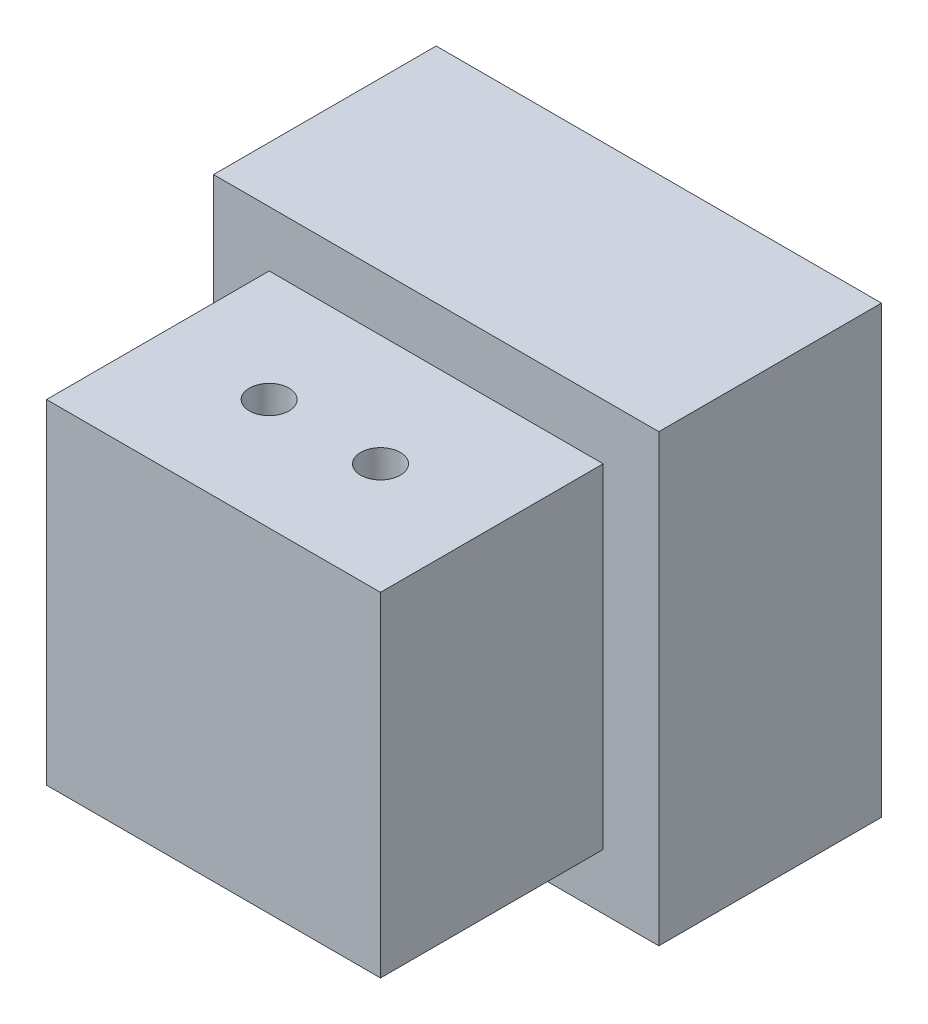
ISO-10303-21;
HEADER;
FILE_DESCRIPTION(('STEP AP214'),'2;1');
FILE_NAME('part.step','',(''),(''),'','','');
FILE_SCHEMA(('AUTOMOTIVE_DESIGN { 1 0 10303 214 1 1 1 1 }'));
ENDSEC;
DATA;
#1=APPLICATION_CONTEXT('core data for automotive mechanical design processes');
#2=APPLICATION_PROTOCOL_DEFINITION('international standard','automotive_design',2000,#1);
#3=PRODUCT_CONTEXT('',#1,'mechanical');
#4=PRODUCT('Part','Part','',(#3));
#5=PRODUCT_RELATED_PRODUCT_CATEGORY('part','',(#4));
#6=PRODUCT_DEFINITION_FORMATION('','',#4);
#7=PRODUCT_DEFINITION_CONTEXT('part definition',#1,'design');
#8=PRODUCT_DEFINITION('design','',#6,#7);
#9=PRODUCT_DEFINITION_SHAPE('','',#8);
#10=(LENGTH_UNIT() NAMED_UNIT(*) SI_UNIT(.MILLI.,.METRE.));
#11=(NAMED_UNIT(*) PLANE_ANGLE_UNIT() SI_UNIT($,.RADIAN.));
#12=(NAMED_UNIT(*) SI_UNIT($,.STERADIAN.) SOLID_ANGLE_UNIT());
#13=UNCERTAINTY_MEASURE_WITH_UNIT(LENGTH_MEASURE(1.E-05),#10,'distance_accuracy_value','');
#14=(GEOMETRIC_REPRESENTATION_CONTEXT(3) GLOBAL_UNCERTAINTY_ASSIGNED_CONTEXT((#13)) GLOBAL_UNIT_ASSIGNED_CONTEXT((#10,
#11,#12)) REPRESENTATION_CONTEXT('',''));
#15=CARTESIAN_POINT('',(0.,0.,0.));
#16=DIRECTION('',(0.,0.,1.));
#17=DIRECTION('',(1.,0.,0.));
#18=AXIS2_PLACEMENT_3D('',#15,#16,#17);
#19=CARTESIAN_POINT('',(-3.175,3.175,12.7));
#20=DIRECTION('',(-1.,0.,0.));
#21=DIRECTION('',(0.,0.,1.));
#22=AXIS2_PLACEMENT_3D('',#19,#20,#21);
#23=PLANE('',#22);
#24=DIRECTION('',(0.,1.,0.));
#25=VECTOR('',#24,1.);
#26=CARTESIAN_POINT('',(-3.175,3.175,0.));
#27=LINE('',#26,#25);
#28=CARTESIAN_POINT('',(-3.175,3.175,0.));
#29=VERTEX_POINT('',#28);
#30=CARTESIAN_POINT('',(-3.175,22.225,0.));
#31=VERTEX_POINT('',#30);
#32=EDGE_CURVE('E128',#29,#31,#27,.T.);
#33=ORIENTED_EDGE('',*,*,#32,.T.);
#34=DIRECTION('',(0.,0.,-1.));
#35=VECTOR('',#34,1.);
#36=CARTESIAN_POINT('',(-3.175,22.225,12.7));
#37=LINE('',#36,#35);
#38=CARTESIAN_POINT('',(-3.175,22.225,12.7));
#39=VERTEX_POINT('',#38);
#40=EDGE_CURVE('E11',#39,#31,#37,.T.);
#41=ORIENTED_EDGE('',*,*,#40,.F.);
#42=DIRECTION('',(0.,1.,0.));
#43=VECTOR('',#42,1.);
#44=CARTESIAN_POINT('',(-3.175,3.175,12.7));
#45=LINE('',#44,#43);
#46=CARTESIAN_POINT('',(-3.175,3.175,12.7));
#47=VERTEX_POINT('',#46);
#48=EDGE_CURVE('E139',#47,#39,#45,.T.);
#49=ORIENTED_EDGE('',*,*,#48,.F.);
#50=DIRECTION('',(0.,0.,-1.));
#51=VECTOR('',#50,1.);
#52=CARTESIAN_POINT('',(-3.175,3.175,12.7));
#53=LINE('',#52,#51);
#54=EDGE_CURVE('E150',#47,#29,#53,.T.);
#55=ORIENTED_EDGE('',*,*,#54,.T.);
#56=EDGE_LOOP('',(#33,#41,#49,#55));
#57=FACE_BOUND('',#56,.T.);
#58=ADVANCED_FACE('F39',(#57),#23,.F.);
#59=CARTESIAN_POINT('',(-3.175,22.225,12.7));
#60=DIRECTION('',(0.,-1.,0.));
#61=DIRECTION('',(1.,0.,0.));
#62=AXIS2_PLACEMENT_3D('',#59,#60,#61);
#63=PLANE('',#62);
#64=CARTESIAN_POINT('',(-9.525,22.225,6.35));
#65=DIRECTION('',(0.,1.,0.));
#66=DIRECTION('',(0.,0.,1.));
#67=AXIS2_PLACEMENT_3D('',#64,#65,#66);
#68=CIRCLE('',#67,1.1303);
#69=CARTESIAN_POINT('',(-9.525,22.225,7.4803));
#70=VERTEX_POINT('',#69);
#71=EDGE_CURVE('E208',#70,#70,#68,.T.);
#72=ORIENTED_EDGE('',*,*,#71,.F.);
#73=EDGE_LOOP('',(#72));
#74=FACE_BOUND('',#73,.T.);
#75=CARTESIAN_POINT('',(-15.875,22.225,6.35));
#76=DIRECTION('',(0.,1.,0.));
#77=DIRECTION('',(0.,0.,1.));
#78=AXIS2_PLACEMENT_3D('',#75,#76,#77);
#79=CIRCLE('',#78,1.1303);
#80=CARTESIAN_POINT('',(-15.875,22.225,7.4803));
#81=VERTEX_POINT('',#80);
#82=EDGE_CURVE('E211',#81,#81,#79,.T.);
#83=ORIENTED_EDGE('',*,*,#82,.F.);
#84=EDGE_LOOP('',(#83));
#85=FACE_BOUND('',#84,.T.);
#86=DIRECTION('',(-1.,0.,0.));
#87=VECTOR('',#86,1.);
#88=CARTESIAN_POINT('',(-3.175,22.225,0.));
#89=LINE('',#88,#87);
#90=CARTESIAN_POINT('',(-22.225,22.225,0.));
#91=VERTEX_POINT('',#90);
#92=EDGE_CURVE('E133',#31,#91,#89,.T.);
#93=ORIENTED_EDGE('',*,*,#92,.T.);
#94=DIRECTION('',(0.,0.,-1.));
#95=VECTOR('',#94,1.);
#96=CARTESIAN_POINT('',(-22.225,22.225,12.7));
#97=LINE('',#96,#95);
#98=CARTESIAN_POINT('',(-22.225,22.225,12.7));
#99=VERTEX_POINT('',#98);
#100=EDGE_CURVE('E48',#99,#91,#97,.T.);
#101=ORIENTED_EDGE('',*,*,#100,.F.);
#102=DIRECTION('',(-1.,0.,0.));
#103=VECTOR('',#102,1.);
#104=CARTESIAN_POINT('',(-3.175,22.225,12.7));
#105=LINE('',#104,#103);
#106=EDGE_CURVE('E142',#39,#99,#105,.T.);
#107=ORIENTED_EDGE('',*,*,#106,.F.);
#108=ORIENTED_EDGE('',*,*,#40,.T.);
#109=EDGE_LOOP('',(#93,#101,#107,#108));
#110=FACE_BOUND('',#109,.T.);
#111=ADVANCED_FACE('F177',(#74,#85,#110),#63,.F.);
#112=CARTESIAN_POINT('',(-22.225,3.175,12.7));
#113=DIRECTION('',(1.,0.,0.));
#114=DIRECTION('',(0.,0.,-1.));
#115=AXIS2_PLACEMENT_3D('',#112,#113,#114);
#116=PLANE('',#115);
#117=DIRECTION('',(0.,-1.,0.));
#118=VECTOR('',#117,1.);
#119=CARTESIAN_POINT('',(-22.225,3.175,0.));
#120=LINE('',#119,#118);
#121=CARTESIAN_POINT('',(-22.225,3.175,0.));
#122=VERTEX_POINT('',#121);
#123=EDGE_CURVE('E155',#91,#122,#120,.T.);
#124=ORIENTED_EDGE('',*,*,#123,.T.);
#125=DIRECTION('',(0.,0.,-1.));
#126=VECTOR('',#125,1.);
#127=CARTESIAN_POINT('',(-22.225,3.175,12.7));
#128=LINE('',#127,#126);
#129=CARTESIAN_POINT('',(-22.225,3.175,12.7));
#130=VERTEX_POINT('',#129);
#131=EDGE_CURVE('E165',#130,#122,#128,.T.);
#132=ORIENTED_EDGE('',*,*,#131,.F.);
#133=DIRECTION('',(0.,-1.,0.));
#134=VECTOR('',#133,1.);
#135=CARTESIAN_POINT('',(-22.225,3.175,12.7));
#136=LINE('',#135,#134);
#137=EDGE_CURVE('E146',#99,#130,#136,.T.);
#138=ORIENTED_EDGE('',*,*,#137,.F.);
#139=ORIENTED_EDGE('',*,*,#100,.T.);
#140=EDGE_LOOP('',(#124,#132,#138,#139));
#141=FACE_BOUND('',#140,.T.);
#142=ADVANCED_FACE('F173',(#141),#116,.F.);
#143=CARTESIAN_POINT('',(-3.175,3.175,12.7));
#144=DIRECTION('',(0.,1.,0.));
#145=DIRECTION('',(-1.,0.,0.));
#146=AXIS2_PLACEMENT_3D('',#143,#144,#145);
#147=PLANE('',#146);
#148=CARTESIAN_POINT('',(-9.525,3.175,6.35));
#149=DIRECTION('',(0.,1.,0.));
#150=DIRECTION('',(-1.,0.,0.));
#151=AXIS2_PLACEMENT_3D('',#148,#149,#150);
#152=CIRCLE('',#151,1.1303);
#153=CARTESIAN_POINT('',(-10.6553,3.175,6.35));
#154=VERTEX_POINT('',#153);
#155=EDGE_CURVE('E215',#154,#154,#152,.F.);
#156=ORIENTED_EDGE('',*,*,#155,.F.);
#157=EDGE_LOOP('',(#156));
#158=FACE_BOUND('',#157,.T.);
#159=CARTESIAN_POINT('',(-15.875,3.175,6.35));
#160=DIRECTION('',(0.,1.,0.));
#161=DIRECTION('',(-1.,0.,0.));
#162=AXIS2_PLACEMENT_3D('',#159,#160,#161);
#163=CIRCLE('',#162,1.1303);
#164=CARTESIAN_POINT('',(-17.0053,3.175,6.35));
#165=VERTEX_POINT('',#164);
#166=EDGE_CURVE('E214',#165,#165,#163,.F.);
#167=ORIENTED_EDGE('',*,*,#166,.F.);
#168=EDGE_LOOP('',(#167));
#169=FACE_BOUND('',#168,.T.);
#170=DIRECTION('',(1.,0.,0.));
#171=VECTOR('',#170,1.);
#172=CARTESIAN_POINT('',(-3.175,3.175,0.));
#173=LINE('',#172,#171);
#174=EDGE_CURVE('E143',#122,#29,#173,.T.);
#175=ORIENTED_EDGE('',*,*,#174,.T.);
#176=ORIENTED_EDGE('',*,*,#54,.F.);
#177=DIRECTION('',(1.,0.,0.));
#178=VECTOR('',#177,1.);
#179=CARTESIAN_POINT('',(-3.175,3.175,12.7));
#180=LINE('',#179,#178);
#181=EDGE_CURVE('E55',#130,#47,#180,.T.);
#182=ORIENTED_EDGE('',*,*,#181,.F.);
#183=ORIENTED_EDGE('',*,*,#131,.T.);
#184=EDGE_LOOP('',(#175,#176,#182,#183));
#185=FACE_BOUND('',#184,.T.);
#186=ADVANCED_FACE('F183',(#158,#169,#185),#147,.F.);
#187=CARTESIAN_POINT('',(0.,0.,12.7));
#188=DIRECTION('',(0.,0.,1.));
#189=DIRECTION('',(1.,0.,0.));
#190=AXIS2_PLACEMENT_3D('',#187,#188,#189);
#191=PLANE('',#190);
#192=ORIENTED_EDGE('',*,*,#48,.T.);
#193=ORIENTED_EDGE('',*,*,#106,.T.);
#194=ORIENTED_EDGE('',*,*,#137,.T.);
#195=ORIENTED_EDGE('',*,*,#181,.T.);
#196=EDGE_LOOP('',(#192,#193,#194,#195));
#197=FACE_BOUND('',#196,.T.);
#198=ADVANCED_FACE('F186',(#197),#191,.T.);
#199=CARTESIAN_POINT('',(-25.4,0.,-12.7));
#200=DIRECTION('',(1.,0.,0.));
#201=DIRECTION('',(0.,0.,-1.));
#202=AXIS2_PLACEMENT_3D('',#199,#200,#201);
#203=PLANE('',#202);
#204=DIRECTION('',(0.,1.,0.));
#205=VECTOR('',#204,1.);
#206=CARTESIAN_POINT('',(-25.4,0.,0.));
#207=LINE('',#206,#205);
#208=CARTESIAN_POINT('',(-25.4,0.,0.));
#209=VERTEX_POINT('',#208);
#210=CARTESIAN_POINT('',(-25.4,25.4,0.));
#211=VERTEX_POINT('',#210);
#212=EDGE_CURVE('E126',#209,#211,#207,.T.);
#213=ORIENTED_EDGE('',*,*,#212,.T.);
#214=DIRECTION('',(0.,0.,1.));
#215=VECTOR('',#214,1.);
#216=CARTESIAN_POINT('',(-25.4,25.4,-12.7));
#217=LINE('',#216,#215);
#218=CARTESIAN_POINT('',(-25.4,25.4,-12.7));
#219=VERTEX_POINT('',#218);
#220=EDGE_CURVE('E104',#219,#211,#217,.T.);
#221=ORIENTED_EDGE('',*,*,#220,.F.);
#222=DIRECTION('',(0.,1.,0.));
#223=VECTOR('',#222,1.);
#224=CARTESIAN_POINT('',(-25.4,0.,-12.7));
#225=LINE('',#224,#223);
#226=CARTESIAN_POINT('',(-25.4,0.,-12.7));
#227=VERTEX_POINT('',#226);
#228=EDGE_CURVE('E112',#227,#219,#225,.T.);
#229=ORIENTED_EDGE('',*,*,#228,.F.);
#230=DIRECTION('',(0.,0.,1.));
#231=VECTOR('',#230,1.);
#232=CARTESIAN_POINT('',(-25.4,0.,-12.7));
#233=LINE('',#232,#231);
#234=EDGE_CURVE('E237',#227,#209,#233,.T.);
#235=ORIENTED_EDGE('',*,*,#234,.T.);
#236=EDGE_LOOP('',(#213,#221,#229,#235));
#237=FACE_BOUND('',#236,.T.);
#238=ADVANCED_FACE('F124',(#237),#203,.F.);
#239=CARTESIAN_POINT('',(-25.4,25.4,-12.7));
#240=DIRECTION('',(0.,-1.,0.));
#241=DIRECTION('',(1.,0.,0.));
#242=AXIS2_PLACEMENT_3D('',#239,#240,#241);
#243=PLANE('',#242);
#244=DIRECTION('',(1.,0.,0.));
#245=VECTOR('',#244,1.);
#246=CARTESIAN_POINT('',(-25.4,25.4,0.));
#247=LINE('',#246,#245);
#248=CARTESIAN_POINT('',(0.,25.4,0.));
#249=VERTEX_POINT('',#248);
#250=EDGE_CURVE('E240',#211,#249,#247,.T.);
#251=ORIENTED_EDGE('',*,*,#250,.T.);
#252=DIRECTION('',(0.,0.,1.));
#253=VECTOR('',#252,1.);
#254=CARTESIAN_POINT('',(0.,25.4,-12.7));
#255=LINE('',#254,#253);
#256=CARTESIAN_POINT('',(0.,25.4,-12.7));
#257=VERTEX_POINT('',#256);
#258=EDGE_CURVE('E107',#257,#249,#255,.T.);
#259=ORIENTED_EDGE('',*,*,#258,.F.);
#260=DIRECTION('',(1.,0.,0.));
#261=VECTOR('',#260,1.);
#262=CARTESIAN_POINT('',(-25.4,25.4,-12.7));
#263=LINE('',#262,#261);
#264=EDGE_CURVE('E100',#219,#257,#263,.T.);
#265=ORIENTED_EDGE('',*,*,#264,.F.);
#266=ORIENTED_EDGE('',*,*,#220,.T.);
#267=EDGE_LOOP('',(#251,#259,#265,#266));
#268=FACE_BOUND('',#267,.T.);
#269=ADVANCED_FACE('F102',(#268),#243,.F.);
#270=CARTESIAN_POINT('',(0.,0.,-12.7));
#271=DIRECTION('',(-1.,0.,0.));
#272=DIRECTION('',(0.,-1.,0.));
#273=AXIS2_PLACEMENT_3D('',#270,#271,#272);
#274=PLANE('',#273);
#275=DIRECTION('',(0.,-1.,0.));
#276=VECTOR('',#275,1.);
#277=CARTESIAN_POINT('',(0.,0.,0.));
#278=LINE('',#277,#276);
#279=CARTESIAN_POINT('',(0.,0.,0.));
#280=VERTEX_POINT('',#279);
#281=EDGE_CURVE('E243',#249,#280,#278,.T.);
#282=ORIENTED_EDGE('',*,*,#281,.T.);
#283=DIRECTION('',(0.,0.,1.));
#284=VECTOR('',#283,1.);
#285=CARTESIAN_POINT('',(0.,0.,-12.7));
#286=LINE('',#285,#284);
#287=CARTESIAN_POINT('',(0.,0.,-12.7));
#288=VERTEX_POINT('',#287);
#289=EDGE_CURVE('E135',#288,#280,#286,.T.);
#290=ORIENTED_EDGE('',*,*,#289,.F.);
#291=DIRECTION('',(0.,-1.,0.));
#292=VECTOR('',#291,1.);
#293=CARTESIAN_POINT('',(0.,0.,-12.7));
#294=LINE('',#293,#292);
#295=EDGE_CURVE('E111',#257,#288,#294,.T.);
#296=ORIENTED_EDGE('',*,*,#295,.F.);
#297=ORIENTED_EDGE('',*,*,#258,.T.);
#298=EDGE_LOOP('',(#282,#290,#296,#297));
#299=FACE_BOUND('',#298,.T.);
#300=ADVANCED_FACE('F257',(#299),#274,.F.);
#301=CARTESIAN_POINT('',(-25.4,0.,-12.7));
#302=DIRECTION('',(0.,1.,0.));
#303=DIRECTION('',(-1.,0.,0.));
#304=AXIS2_PLACEMENT_3D('',#301,#302,#303);
#305=PLANE('',#304);
#306=DIRECTION('',(-1.,0.,0.));
#307=VECTOR('',#306,1.);
#308=CARTESIAN_POINT('',(-25.4,0.,0.));
#309=LINE('',#308,#307);
#310=EDGE_CURVE('E122',#280,#209,#309,.T.);
#311=ORIENTED_EDGE('',*,*,#310,.T.);
#312=ORIENTED_EDGE('',*,*,#234,.F.);
#313=DIRECTION('',(-1.,0.,0.));
#314=VECTOR('',#313,1.);
#315=CARTESIAN_POINT('',(-25.4,0.,-12.7));
#316=LINE('',#315,#314);
#317=EDGE_CURVE('E117',#288,#227,#316,.T.);
#318=ORIENTED_EDGE('',*,*,#317,.F.);
#319=ORIENTED_EDGE('',*,*,#289,.T.);
#320=EDGE_LOOP('',(#311,#312,#318,#319));
#321=FACE_BOUND('',#320,.T.);
#322=ADVANCED_FACE('F254',(#321),#305,.F.);
#323=CARTESIAN_POINT('',(0.,0.,-12.7));
#324=DIRECTION('',(0.,0.,-1.));
#325=DIRECTION('',(-1.,0.,0.));
#326=AXIS2_PLACEMENT_3D('',#323,#324,#325);
#327=PLANE('',#326);
#328=CARTESIAN_POINT('',(-12.7,12.7,-12.7));
#329=DIRECTION('',(0.,0.,-1.));
#330=DIRECTION('',(-1.,0.,0.));
#331=AXIS2_PLACEMENT_3D('',#328,#329,#330);
#332=CIRCLE('',#331,9.525);
#333=CARTESIAN_POINT('',(-22.225,12.7,-12.7));
#334=VERTEX_POINT('',#333);
#335=EDGE_CURVE('E220',#334,#334,#332,.T.);
#336=ORIENTED_EDGE('',*,*,#335,.F.);
#337=EDGE_LOOP('',(#336));
#338=FACE_BOUND('',#337,.T.);
#339=ORIENTED_EDGE('',*,*,#228,.T.);
#340=ORIENTED_EDGE('',*,*,#264,.T.);
#341=ORIENTED_EDGE('',*,*,#295,.T.);
#342=ORIENTED_EDGE('',*,*,#317,.T.);
#343=EDGE_LOOP('',(#339,#340,#341,#342));
#344=FACE_BOUND('',#343,.T.);
#345=ADVANCED_FACE('F115',(#338,#344),#327,.T.);
#346=CARTESIAN_POINT('',(0.,0.,0.));
#347=DIRECTION('',(0.,0.,-1.));
#348=DIRECTION('',(-1.,0.,0.));
#349=AXIS2_PLACEMENT_3D('',#346,#347,#348);
#350=PLANE('',#349);
#351=ORIENTED_EDGE('',*,*,#32,.F.);
#352=ORIENTED_EDGE('',*,*,#174,.F.);
#353=ORIENTED_EDGE('',*,*,#123,.F.);
#354=ORIENTED_EDGE('',*,*,#92,.F.);
#355=EDGE_LOOP('',(#351,#352,#353,#354));
#356=FACE_BOUND('',#355,.T.);
#357=ORIENTED_EDGE('',*,*,#212,.F.);
#358=ORIENTED_EDGE('',*,*,#310,.F.);
#359=ORIENTED_EDGE('',*,*,#281,.F.);
#360=ORIENTED_EDGE('',*,*,#250,.F.);
#361=EDGE_LOOP('',(#357,#358,#359,#360));
#362=FACE_BOUND('',#361,.T.);
#363=ADVANCED_FACE('F180',(#356,#362),#350,.F.);
#364=CARTESIAN_POINT('',(-12.7,12.7,-2.54));
#365=DIRECTION('',(0.,0.,-1.));
#366=DIRECTION('',(-1.,0.,0.));
#367=AXIS2_PLACEMENT_3D('',#364,#365,#366);
#368=CYLINDRICAL_SURFACE('',#367,9.525);
#369=CARTESIAN_POINT('',(-12.7,12.7,-2.54));
#370=DIRECTION('',(0.,0.,-1.));
#371=DIRECTION('',(-1.,0.,0.));
#372=AXIS2_PLACEMENT_3D('',#369,#370,#371);
#373=CIRCLE('',#372,9.525);
#374=CARTESIAN_POINT('',(-22.225,12.7,-2.54));
#375=VERTEX_POINT('',#374);
#376=EDGE_CURVE('E226',#375,#375,#373,.T.);
#377=ORIENTED_EDGE('',*,*,#376,.F.);
#378=EDGE_LOOP('',(#377));
#379=FACE_BOUND('',#378,.T.);
#380=ORIENTED_EDGE('',*,*,#335,.T.);
#381=EDGE_LOOP('',(#380));
#382=FACE_BOUND('',#381,.T.);
#383=ADVANCED_FACE('F269',(#379,#382),#368,.F.);
#384=CARTESIAN_POINT('',(-12.7,12.7,-2.54));
#385=DIRECTION('',(0.,0.,-1.));
#386=DIRECTION('',(-1.,0.,0.));
#387=AXIS2_PLACEMENT_3D('',#384,#385,#386);
#388=PLANE('',#387);
#389=ORIENTED_EDGE('',*,*,#376,.T.);
#390=EDGE_LOOP('',(#389));
#391=FACE_BOUND('',#390,.T.);
#392=ADVANCED_FACE('F275',(#391),#388,.T.);
#393=CARTESIAN_POINT('',(-15.875,22.225,6.35));
#394=DIRECTION('',(0.,1.,0.));
#395=DIRECTION('',(0.,0.,1.));
#396=AXIS2_PLACEMENT_3D('',#393,#394,#395);
#397=CYLINDRICAL_SURFACE('',#396,1.1303);
#398=ORIENTED_EDGE('',*,*,#166,.T.);
#399=EDGE_LOOP('',(#398));
#400=FACE_BOUND('',#399,.T.);
#401=ORIENTED_EDGE('',*,*,#82,.T.);
#402=EDGE_LOOP('',(#401));
#403=FACE_BOUND('',#402,.T.);
#404=ADVANCED_FACE('F279',(#400,#403),#397,.F.);
#405=CARTESIAN_POINT('',(-9.525,22.225,6.35));
#406=DIRECTION('',(0.,1.,0.));
#407=DIRECTION('',(0.,0.,1.));
#408=AXIS2_PLACEMENT_3D('',#405,#406,#407);
#409=CYLINDRICAL_SURFACE('',#408,1.1303);
#410=ORIENTED_EDGE('',*,*,#155,.T.);
#411=EDGE_LOOP('',(#410));
#412=FACE_BOUND('',#411,.T.);
#413=ORIENTED_EDGE('',*,*,#71,.T.);
#414=EDGE_LOOP('',(#413));
#415=FACE_BOUND('',#414,.T.);
#416=ADVANCED_FACE('F283',(#412,#415),#409,.F.);
#417=CLOSED_SHELL('',(#58,#111,#142,#186,#198,#238,#269,#300,#322,#345,#363,#383,#392,#404,#416));
#418=MANIFOLD_SOLID_BREP('B2',#417);
#419=ADVANCED_BREP_SHAPE_REPRESENTATION('',(#18,#418),#14);
#420=SHAPE_DEFINITION_REPRESENTATION(#9,#419);
ENDSEC;
END-ISO-10303-21;
